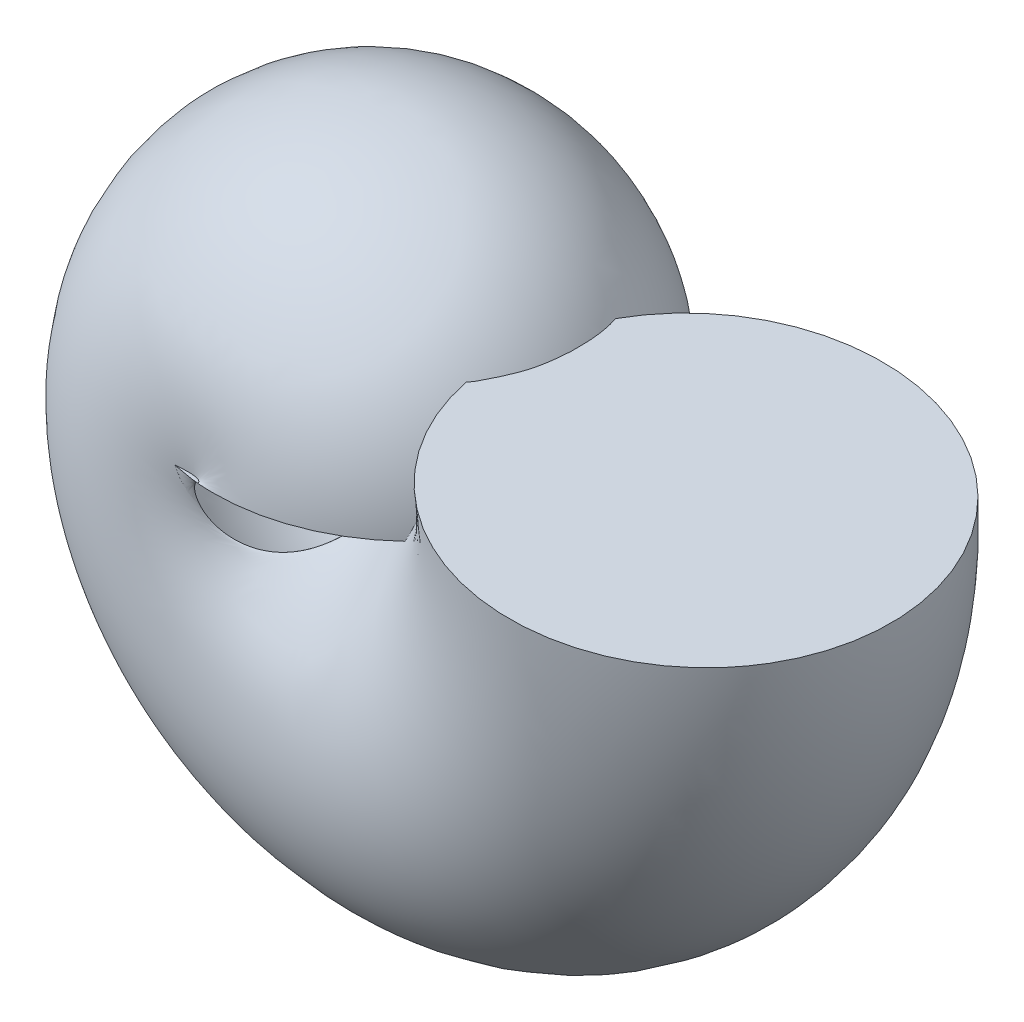
ISO-10303-21;
HEADER;
FILE_DESCRIPTION(('STEP AP214'),'2;1');
FILE_NAME('part.step','',(''),(''),'','','');
FILE_SCHEMA(('AUTOMOTIVE_DESIGN { 1 0 10303 214 1 1 1 1 }'));
ENDSEC;
DATA;
#1=APPLICATION_CONTEXT('core data for automotive mechanical design processes');
#2=APPLICATION_PROTOCOL_DEFINITION('international standard','automotive_design',2000,#1);
#3=PRODUCT_CONTEXT('',#1,'mechanical');
#4=PRODUCT('Part','Part','',(#3));
#5=PRODUCT_RELATED_PRODUCT_CATEGORY('part','',(#4));
#6=PRODUCT_DEFINITION_FORMATION('','',#4);
#7=PRODUCT_DEFINITION_CONTEXT('part definition',#1,'design');
#8=PRODUCT_DEFINITION('design','',#6,#7);
#9=PRODUCT_DEFINITION_SHAPE('','',#8);
#10=(LENGTH_UNIT() NAMED_UNIT(*) SI_UNIT(.MILLI.,.METRE.));
#11=(NAMED_UNIT(*) PLANE_ANGLE_UNIT() SI_UNIT($,.RADIAN.));
#12=(NAMED_UNIT(*) SI_UNIT($,.STERADIAN.) SOLID_ANGLE_UNIT());
#13=UNCERTAINTY_MEASURE_WITH_UNIT(LENGTH_MEASURE(1.E-05),#10,'distance_accuracy_value','');
#14=(GEOMETRIC_REPRESENTATION_CONTEXT(3) GLOBAL_UNCERTAINTY_ASSIGNED_CONTEXT((#13)) GLOBAL_UNIT_ASSIGNED_CONTEXT((#10,
#11,#12)) REPRESENTATION_CONTEXT('',''));
#15=CARTESIAN_POINT('',(0.,0.,0.));
#16=DIRECTION('',(0.,0.,1.));
#17=DIRECTION('',(1.,0.,0.));
#18=AXIS2_PLACEMENT_3D('',#15,#16,#17);
#19=CARTESIAN_POINT('',(3.387602655249,1.001778484555,0.558646099357));
#20=DIRECTION('',(-0.0667866322718841,-0.99748590110121,-0.023694363339985));
#21=DIRECTION('',(-0.997766024748347,0.0668053879405019,0.));
#22=AXIS2_PLACEMENT_3D('',#19,#20,#21);
#23=PLANE('',#22);
#24=CARTESIAN_POINT('',(4.93570971665,0.868226377357999,1.817320431986));
#25=CARTESIAN_POINT('',(2.844036724606,0.946964770413,4.398329135522));
#26=CARTESIAN_POINT('',(-0.637456450798,1.232702980303,2.182501237778));
#27=CARTESIAN_POINT('',(-0.869244302373,1.369008177759,-2.9023445111));
#28=CARTESIAN_POINT('',(4.146546819796,1.052615207822,-3.720694016029));
#29=CARTESIAN_POINT('',(7.027382708693,0.789487984304,-0.76368827155));
#30=CARTESIAN_POINT('',(4.93570971665,0.868226377357999,1.817320431986));
#31=(BOUNDED_CURVE() B_SPLINE_CURVE(6,(#24,#25,#26,#27,#28,#29,#30),.UNSPECIFIED.,.T.,
.F.) B_SPLINE_CURVE_WITH_KNOTS((7,7),(0.,6.28318530718),
.UNSPECIFIED.) CURVE() GEOMETRIC_REPRESENTATION_ITEM() RATIONAL_B_SPLINE_CURVE((1.669078461068,
1.03672962321,1.038346699848,0.853534330196,1.038346699848,1.03672962321,1.669078461068)) REPRESENTATION_ITEM(''));
#32=CARTESIAN_POINT('',(4.93570971665,0.868226377358,1.817320431986));
#33=VERTEX_POINT('',#32);
#34=EDGE_CURVE('E10',#33,#33,#31,.T.);
#35=ORIENTED_EDGE('',*,*,#34,.F.);
#36=EDGE_LOOP('',(#35));
#37=FACE_BOUND('',#36,.T.);
#38=ADVANCED_FACE('F16',(#37),#23,.F.);
#39=CARTESIAN_POINT('',(0.0003168464698303,-1.46129961908E-09,3.069245062878E-10));
#40=DIRECTION('',(-8.32738525506E-09,-1.,0.));
#41=DIRECTION('',(-1.,8.32738525506E-09,0.));
#42=AXIS2_PLACEMENT_3D('',#39,#40,#41);
#43=PLANE('',#42);
#44=CARTESIAN_POINT('',(2.,-1.811343164348E-08,-1.521510029079E-09));
#45=CARTESIAN_POINT('',(1.999999996962,-1.811353755876E-08,-3.323086152664));
#46=CARTESIAN_POINT('',(-2.109096384571,1.6104475975E-08,-3.800224764256));
#47=CARTESIAN_POINT('',(-5.498233842017,4.432724987069E-08,5.33458877072201E-09));
#48=CARTESIAN_POINT('',(-2.109096377621,1.610471844771E-08,3.800224768727));
#49=CARTESIAN_POINT('',(2.000000003039,-1.811332572821E-08,3.323086149621));
#50=CARTESIAN_POINT('',(2.,-1.811343164348E-08,-1.521510029079E-09));
#51=(BOUNDED_CURVE() B_SPLINE_CURVE(6,(#44,#45,#46,#47,#48,#49,#50),.UNSPECIFIED.,.T.,
.F.) B_SPLINE_CURVE_WITH_KNOTS((7,7),(0.,6.28318530718),
.UNSPECIFIED.) CURVE() GEOMETRIC_REPRESENTATION_ITEM() RATIONAL_B_SPLINE_CURVE((1.669078461068,
1.03672962321,1.038346699848,0.853534330196,1.038346699848,1.03672962321,1.669078461068)) REPRESENTATION_ITEM(''));
#52=CARTESIAN_POINT('',(2.,-1.811343164348E-08,-1.521510029079E-09));
#53=VERTEX_POINT('',#52);
#54=EDGE_CURVE('E46',#53,#53,#51,.F.);
#55=ORIENTED_EDGE('',*,*,#54,.T.);
#56=EDGE_LOOP('',(#55));
#57=FACE_BOUND('',#56,.T.);
#58=ADVANCED_FACE('F53',(#57),#43,.T.);
#59=CARTESIAN_POINT('',(2.,-1.811343164348E-08,-1.521510029079E-09));
#60=CARTESIAN_POINT('',(1.999996340509,0.675460915999,0.056737985904));
#61=CARTESIAN_POINT('',(1.764784120873,1.349985488167,0.114675462791));
#62=CARTESIAN_POINT('',(1.294635523885,1.942252972457,0.170679237265));
#63=CARTESIAN_POINT('',(0.62085597881,2.356018194478,0.231549033671));
#64=CARTESIAN_POINT('',(-0.189119474861,2.536750837144,0.292504625938));
#65=CARTESIAN_POINT('',(-1.046404143153,2.411862251604,0.355225189389));
#66=CARTESIAN_POINT('',(-1.830588253357,1.992276139426,0.425150073034));
#67=CARTESIAN_POINT('',(-2.429150534033,1.305517696971,0.49570814134));
#68=CARTESIAN_POINT('',(-2.751009323906,0.449195493155,0.573314928534));
#69=CARTESIAN_POINT('',(-2.760888106201,-1.371051871058,0.738587406022999));
#70=CARTESIAN_POINT('',(-2.448419733408,-2.3341362564,0.827540381963001));
#71=CARTESIAN_POINT('',(-1.778492952531,-3.234277503867,0.920746746367));
#72=CARTESIAN_POINT('',(-0.753990139637,-3.91881504647,1.024855805375));
#73=CARTESIAN_POINT('',(0.546010515183,-4.248569805386,1.132431160502));
#74=CARTESIAN_POINT('',(1.980200108286,-4.077733674473,1.250503405502));
#75=CARTESIAN_POINT('',(3.324347708968,-3.380813836976,1.378300281682));
#76=CARTESIAN_POINT('',(4.364253257033,-2.204658964124,1.513321697351));
#77=CARTESIAN_POINT('',(4.926347680218,-0.718856077384999,1.660443123118));
#78=CARTESIAN_POINT('',(4.93570971665,0.868226377357999,1.817320431986));
#79=CARTESIAN_POINT('',(2.000000003039,-1.811332572821E-08,3.323086149621));
#80=CARTESIAN_POINT('',(1.88668881717,0.67545697964,3.37982413715));
#81=CARTESIAN_POINT('',(1.538478403761,1.271357655659,3.43346888578));
#82=CARTESIAN_POINT('',(1.000777358273,1.706528063401,3.480932668996));
#83=CARTESIAN_POINT('',(0.353295972472,1.911981052704,3.528827672385));
#84=CARTESIAN_POINT('',(-0.312046832857,1.88942324545,3.572912020766));
#85=CARTESIAN_POINT('',(-0.910445775039,1.634621882277,3.613961792315));
#86=CARTESIAN_POINT('',(-1.376435814428,1.214217793254,3.658614785018));
#87=CARTESIAN_POINT('',(-1.665082671639,0.671805335479,3.69931241515));
#88=CARTESIAN_POINT('',(-1.753631491296,0.08408717451493,3.743166651779));
#89=CARTESIAN_POINT('',(-1.537396895451,-1.046492277407,3.832736222752));
#90=CARTESIAN_POINT('',(-1.232453007259,-1.588436541943,3.879855588941));
#91=CARTESIAN_POINT('',(-0.734312119986,-2.039252055833,3.927082922165));
#92=CARTESIAN_POINT('',(-0.0700677397568,-2.319902737307,3.98155617856));
#93=CARTESIAN_POINT('',(0.701307869548,-2.38162511067,4.03555622178));
#94=CARTESIAN_POINT('',(1.500466995373,-2.155005078384,4.09604636228));
#95=CARTESIAN_POINT('',(2.211482265818,-1.652223220538,4.163239817729));
#96=CARTESIAN_POINT('',(2.724052180226,-0.896208185273,4.233438131937));
#97=CARTESIAN_POINT('',(2.947119895485,0.009414257825842,4.31276328779));
#98=CARTESIAN_POINT('',(2.844036724606,0.946964770413,4.398329135522));
#99=CARTESIAN_POINT('',(-2.109096377621,1.610471844771E-08,3.800224768727));
#100=CARTESIAN_POINT('',(-2.238676606639,-0.600554760157,3.716854578086));
#101=CARTESIAN_POINT('',(-2.157532497991,-1.292231640267,3.630153925636));
#102=CARTESIAN_POINT('',(-1.813620474966,-1.977808796617,3.53605126004));
#103=CARTESIAN_POINT('',(-1.20220956853,-2.548325148306,3.443281125868));
#104=CARTESIAN_POINT('',(-0.389456348817,-2.855537553218,3.346167991365));
#105=CARTESIAN_POINT('',(0.491624368972999,-2.855906387194,3.24588902637));
#106=CARTESIAN_POINT('',(1.291588214315,-2.532144757902,3.150973398731));
#107=CARTESIAN_POINT('',(1.898140046321,-1.985554777541,3.051643710985));
#108=CARTESIAN_POINT('',(2.261289003878,-1.315864255516,2.957139778247));
#109=CARTESIAN_POINT('',(2.506867104539,0.05625268619741,2.771995406831));
#110=CARTESIAN_POINT('',(2.389564005141,0.75987283653,2.683182653594));
#111=CARTESIAN_POINT('',(2.034896453562,1.37440270074,2.59522708488));
#112=CARTESIAN_POINT('',(1.503108199706,1.812279468601,2.51743856016));
#113=CARTESIAN_POINT('',(0.896209761072,1.997372789655,2.439706817667));
#114=CARTESIAN_POINT('',(0.34416439129,1.973408759929,2.371207767681));
#115=CARTESIAN_POINT('',(-0.07895084980994,1.791757196445,2.312052026615));
#116=CARTESIAN_POINT('',(-0.3533185622,1.573813860103,2.257578833726));
#117=CARTESIAN_POINT('',(-0.521186108678,1.376276128282,2.215630209723));
#118=CARTESIAN_POINT('',(-0.637456450798,1.232702980303,2.182501237778));
#119=CARTESIAN_POINT('',(-5.498233842017,4.432724987069E-08,5.33458877072201E-09));
#120=CARTESIAN_POINT('',(-5.498237521132,-1.652990228688,-0.198929868437));
#121=CARTESIAN_POINT('',(-4.920361831983,-3.307422866563,-0.39596840257));
#122=CARTESIAN_POINT('',(-3.76405328126,-4.719122407854,-0.59605597396));
#123=CARTESIAN_POINT('',(-2.147510374759,-5.666757891765,-0.788470864183));
#124=CARTESIAN_POINT('',(-0.298167477189,-5.95219597043401,-0.980750472617001));
#125=CARTESIAN_POINT('',(1.476455753692,-5.578760607001,-1.170247097047));
#126=CARTESIAN_POINT('',(2.919000759649,-4.6401869914,-1.348384041535));
#127=CARTESIAN_POINT('',(3.872786672909,-3.37756566838,-1.525522588548));
#128=CARTESIAN_POINT('',(4.314051785786,-2.009758930177,-1.691546805756));
#129=CARTESIAN_POINT('',(4.298475048703,0.556187580485,-2.007734490399));
#130=CARTESIAN_POINT('',(3.842403246766,1.755653076302,-2.155868182286));
#131=CARTESIAN_POINT('',(3.001143965265,2.681815121451,-2.297295185639));
#132=CARTESIAN_POINT('',(1.937530416824,3.20261671024,-2.42153095955));
#133=CARTESIAN_POINT('',(0.860976092228001,3.253021711873,-2.540301122076));
#134=CARTESIAN_POINT('',(-0.004113932823308,2.951978940637,-2.64251992287));
#135=CARTESIAN_POINT('',(-0.563629062108001,2.450818033937,-2.729405049572));
#136=CARTESIAN_POINT('',(-0.821552138828,1.959784660603,-2.804898614791));
#137=CARTESIAN_POINT('',(-0.884004150063,1.58456529477,-2.861313038806));
#138=CARTESIAN_POINT('',(-0.869244302373,1.369008177759,-2.9023445111));
#139=CARTESIAN_POINT('',(-2.109096384571,1.6104475975E-08,-3.800224764256));
#140=CARTESIAN_POINT('',(-1.979523496044,-0.600545757049,-3.883594955133));
#141=CARTESIAN_POINT('',(-1.639933764855,-1.112396738108,-3.96047742563));
#142=CARTESIAN_POINT('',(-1.141518080986,-1.438666808278,-4.035047713908));
#143=CARTESIAN_POINT('',(-0.590255429297,-1.532738511871,-4.098142343131));
#144=CARTESIAN_POINT('',(-0.108301079836,-1.374991919369,-4.156668142883));
#145=CARTESIAN_POINT('',(0.180665017201,-1.078228670341,-4.207382410276));
#146=CARTESIAN_POINT('',(0.252866214533,-0.752596192251,-4.244497029161));
#147=CARTESIAN_POINT('',(0.150590038959,-0.53614943477,-4.275530939114));
#148=CARTESIAN_POINT('',(-0.0198796259108,-0.480800936757,-4.292837187075));
#149=CARTESIAN_POINT('',(-0.291460347235,-0.686068968975,-4.304836447499));
#150=CARTESIAN_POINT('',(-0.391553701575,-0.945666168092,-4.297968792456));
#151=CARTESIAN_POINT('',(-0.353318404587,-1.358818827474,-4.280762686098));
#152=CARTESIAN_POINT('',(-0.0611358338051799,-1.844698340801,-4.245025892596));
#153=CARTESIAN_POINT('',(0.541018938212,-2.272639568639,-4.200222005301));
#154=CARTESIAN_POINT('',(1.441393637888,-2.424190638802,-4.13702122587));
#155=CARTESIAN_POINT('',(2.466357111814,-2.161816423337,-4.057566885868));
#156=CARTESIAN_POINT('',(3.398093511161,-1.41883022396,-3.963778887562));
#157=CARTESIAN_POINT('',(4.00563631119,-0.289398993392,-3.850666190678));
#158=CARTESIAN_POINT('',(4.146546819796,1.052615207822,-3.720694016029));
#159=CARTESIAN_POINT('',(1.999999996962,-1.811353755876E-08,-3.323086152664));
#160=CARTESIAN_POINT('',(2.113303863847,0.675464852359,-3.266348165342));
#161=CARTESIAN_POINT('',(1.991089837985,1.428613320674,-3.204117960196));
#162=CARTESIAN_POINT('',(1.588493689496,2.177977881513,-3.139574194469));
#163=CARTESIAN_POINT('',(0.888415985149,2.800055336252,-3.065729605039));
#164=CARTESIAN_POINT('',(-0.0661921168658,3.184078428837,-2.987902768894));
#165=CARTESIAN_POINT('',(-1.182362511268,3.189102620931,-2.903511413533));
#166=CARTESIAN_POINT('',(-2.284740692286,2.770334485598,-2.808314638952));
#167=CARTESIAN_POINT('',(-3.193218396426,1.939230058464,-2.70789613247));
#168=CARTESIAN_POINT('',(-3.748387156517,0.814303811795,-2.596536794711));
#169=CARTESIAN_POINT('',(-3.984379316951,-1.69561146471,-2.355561410706));
#170=CARTESIAN_POINT('',(-3.664386459557,-3.079835970857,-2.224774825016));
#171=CARTESIAN_POINT('',(-2.822673785076,-4.429302951901,-2.085589429431));
#172=CARTESIAN_POINT('',(-1.437912539518,-5.517727355634,-1.931844567811));
#173=CARTESIAN_POINT('',(0.390713160817,-6.115514500099,-1.770693900775));
#174=CARTESIAN_POINT('',(2.4599332212,-6.000462270563,-1.595039551277));
#175=CARTESIAN_POINT('',(4.437213152118,-5.109404453412,-1.406639254364));
#176=CARTESIAN_POINT('',(6.00445433384,-3.513109742975,-1.206794737236));
#177=CARTESIAN_POINT('',(6.905575464951,-1.447126412596,-0.991877041552999));
#178=CARTESIAN_POINT('',(7.027382708693,0.789487984304,-0.76368827155));
#179=CARTESIAN_POINT('',(2.,-1.811343164348E-08,-1.521510029079E-09));
#180=CARTESIAN_POINT('',(1.999996340509,0.675460915999,0.056737985904));
#181=CARTESIAN_POINT('',(1.764784120873,1.349985488167,0.114675462791));
#182=CARTESIAN_POINT('',(1.294635523885,1.942252972457,0.170679237265));
#183=CARTESIAN_POINT('',(0.62085597881,2.356018194478,0.231549033671));
#184=CARTESIAN_POINT('',(-0.189119474861,2.536750837144,0.292504625938));
#185=CARTESIAN_POINT('',(-1.046404143153,2.411862251604,0.355225189389));
#186=CARTESIAN_POINT('',(-1.830588253357,1.992276139426,0.425150073034));
#187=CARTESIAN_POINT('',(-2.429150534033,1.305517696971,0.49570814134));
#188=CARTESIAN_POINT('',(-2.751009323906,0.449195493155,0.573314928534));
#189=CARTESIAN_POINT('',(-2.760888106201,-1.371051871058,0.738587406022999));
#190=CARTESIAN_POINT('',(-2.448419733408,-2.3341362564,0.827540381963001));
#191=CARTESIAN_POINT('',(-1.778492952531,-3.234277503867,0.920746746367));
#192=CARTESIAN_POINT('',(-0.753990139637,-3.91881504647,1.024855805375));
#193=CARTESIAN_POINT('',(0.546010515183,-4.248569805386,1.132431160502));
#194=CARTESIAN_POINT('',(1.980200108286,-4.077733674473,1.250503405502));
#195=CARTESIAN_POINT('',(3.324347708968,-3.380813836976,1.378300281682));
#196=CARTESIAN_POINT('',(4.364253257033,-2.204658964124,1.513321697351));
#197=CARTESIAN_POINT('',(4.926347680218,-0.718856077384999,1.660443123118));
#198=CARTESIAN_POINT('',(4.93570971665,0.868226377357999,1.817320431986));
#199=(BOUNDED_SURFACE() B_SPLINE_SURFACE(6,10,((#59,#60,#61,#62,#63,#64,#65,#66,#67,#68,#69,#70,
#71,#72,#73,#74,#75,#76,#77,#78),(#79,#80,#81,#82,#83,#84,#85,#86,#87,#88,#89,#90,#91,#92,#93,
#94,#95,#96,#97,#98),(#99,#100,#101,#102,#103,#104,#105,#106,#107,#108,#109,#110,#111,#112,#113,
#114,#115,#116,#117,#118),(#119,#120,#121,#122,#123,#124,#125,#126,#127,#128,#129,#130,#131,
#132,#133,#134,#135,#136,#137,#138),(#139,#140,#141,#142,#143,#144,#145,#146,#147,#148,#149,
#150,#151,#152,#153,#154,#155,#156,#157,#158),(#159,#160,#161,#162,#163,#164,#165,#166,#167,
#168,#169,#170,#171,#172,#173,#174,#175,#176,#177,#178),(#179,#180,#181,#182,#183,#184,#185,
#186,#187,#188,#189,#190,#191,#192,#193,#194,#195,#196,#197,#198)),.UNSPECIFIED.,.T.,.F.,
.F.) B_SPLINE_SURFACE_WITH_KNOTS((7,7),(11,9,11),(0.,6.28318530718),(0.,0.5,1.),
.UNSPECIFIED.) GEOMETRIC_REPRESENTATION_ITEM() RATIONAL_B_SPLINE_SURFACE(((1.669078461068,
1.669078461068,1.669078461068,1.669078461069,1.669078461068,1.669078461069,1.669078461068,
1.669078461068,1.669078461068,1.669078461068,1.669078461068,1.669078461068,1.669078461068,
1.669078461068,1.669078461068,1.669078461068,1.669078461068,1.669078461068,1.669078461068,
1.669078461068),(1.03672962321,1.03672962321,1.036729623209,1.03672962321,1.036729623209,
1.03672962321,1.036729623209,1.03672962321,1.03672962321,1.03672962321,1.03672962321,
1.03672962321,1.03672962321,1.03672962321,1.03672962321,1.03672962321,1.03672962321,
1.03672962321,1.03672962321,1.03672962321),(1.038346699848,1.038346699848,1.038346699847,
1.038346699848,1.038346699847,1.038346699848,1.038346699847,1.038346699848,1.038346699847,
1.038346699848,1.038346699847,1.038346699848,1.038346699847,1.038346699848,1.038346699847,
1.038346699848,1.038346699847,1.038346699848,1.038346699847,1.038346699848),(0.853534330196,
0.853534330196,0.853534330196,0.853534330196,0.853534330196,0.853534330196,0.853534330196,
0.853534330196,0.853534330196,0.853534330196,0.853534330196,0.853534330196,0.853534330196,
0.853534330196,0.853534330196,0.853534330196,0.853534330196,0.853534330196,0.853534330196,
0.853534330196),(1.038346699848,1.038346699848,1.038346699847,1.038346699848,1.038346699847,
1.038346699848,1.038346699847,1.038346699848,1.038346699847,1.038346699848,1.038346699847,
1.038346699848,1.038346699847,1.038346699848,1.038346699847,1.038346699847,1.038346699848,
1.038346699847,1.038346699848,1.038346699848),(1.03672962321,1.03672962321,1.036729623209,
1.03672962321,1.036729623209,1.03672962321,1.036729623209,1.03672962321,1.03672962321,
1.03672962321,1.03672962321,1.03672962321,1.03672962321,1.036729623209,1.03672962321,
1.036729623209,1.03672962321,1.03672962321,1.03672962321,1.03672962321),(1.669078461068,
1.669078461068,1.669078461068,1.669078461069,1.669078461068,1.669078461069,1.669078461068,
1.669078461068,1.669078461068,1.669078461068,1.669078461068,1.669078461068,1.669078461068,
1.669078461068,1.669078461068,1.669078461068,1.669078461068,1.669078461068,1.669078461068,1.669078461068))) REPRESENTATION_ITEM('') SURFACE());
#200=CARTESIAN_POINT('',(2.,-1.811343164348E-08,-1.521510029079E-09));
#201=CARTESIAN_POINT('',(1.999996340509,0.675460915999,0.056737985904));
#202=CARTESIAN_POINT('',(1.764784120873,1.349985488167,0.114675462791));
#203=CARTESIAN_POINT('',(1.294635523885,1.942252972457,0.170679237265));
#204=CARTESIAN_POINT('',(0.62085597881,2.356018194478,0.231549033671));
#205=CARTESIAN_POINT('',(-0.189119474861,2.536750837144,0.292504625938));
#206=CARTESIAN_POINT('',(-1.046404143153,2.411862251604,0.355225189389));
#207=CARTESIAN_POINT('',(-1.830588253357,1.992276139426,0.425150073034));
#208=CARTESIAN_POINT('',(-2.429150534033,1.305517696971,0.49570814134));
#209=CARTESIAN_POINT('',(-2.751009323906,0.449195493155,0.573314928534));
#210=CARTESIAN_POINT('',(-2.760888106201,-1.371051871058,0.738587406022999));
#211=CARTESIAN_POINT('',(-2.448419733408,-2.3341362564,0.827540381963001));
#212=CARTESIAN_POINT('',(-1.778492952531,-3.234277503867,0.920746746367));
#213=CARTESIAN_POINT('',(-0.753990139637,-3.91881504647,1.024855805375));
#214=CARTESIAN_POINT('',(0.546010515183,-4.248569805386,1.132431160502));
#215=CARTESIAN_POINT('',(1.980200108286,-4.077733674473,1.250503405502));
#216=CARTESIAN_POINT('',(3.324347708968,-3.380813836976,1.378300281682));
#217=CARTESIAN_POINT('',(4.364253257033,-2.204658964124,1.513321697351));
#218=CARTESIAN_POINT('',(4.926347680218,-0.718856077384999,1.660443123118));
#219=CARTESIAN_POINT('',(4.93570971665,0.868226377357999,1.817320431986));
#220=(BOUNDED_CURVE() B_SPLINE_CURVE(10,(#200,#201,#202,#203,#204,#205,#206,#207,#208,#209,#210,
#211,#212,#213,#214,#215,#216,#217,#218,#219),.UNSPECIFIED.,.F.,
.F.) B_SPLINE_CURVE_WITH_KNOTS((11,9,11),(0.,0.5,1.),
.UNSPECIFIED.) CURVE() GEOMETRIC_REPRESENTATION_ITEM() RATIONAL_B_SPLINE_CURVE((1.669078461068,
1.669078461068,1.669078461068,1.669078461069,1.669078461068,1.669078461069,1.669078461068,
1.669078461068,1.669078461068,1.669078461068,1.669078461068,1.669078461068,1.669078461068,
1.669078461068,1.669078461068,1.669078461068,1.669078461068,1.669078461068,1.669078461068,1.669078461068)) REPRESENTATION_ITEM(''));
#221=EDGE_CURVE('E28',#53,#33,#220,.T.);
#222=ORIENTED_EDGE('',*,*,#54,.F.);
#223=ORIENTED_EDGE('',*,*,#221,.T.);
#224=ORIENTED_EDGE('',*,*,#34,.T.);
#225=ORIENTED_EDGE('',*,*,#221,.F.);
#226=EDGE_LOOP('',(#222,#223,#224,#225));
#227=FACE_BOUND('',#226,.T.);
#228=ADVANCED_FACE('F45',(#227),#199,.F.);
#229=CLOSED_SHELL('',(#38,#58,#228));
#230=MANIFOLD_SOLID_BREP('B1',#229);
#231=ADVANCED_BREP_SHAPE_REPRESENTATION('',(#18,#230),#14);
#232=SHAPE_DEFINITION_REPRESENTATION(#9,#231);
ENDSEC;
END-ISO-10303-21;
